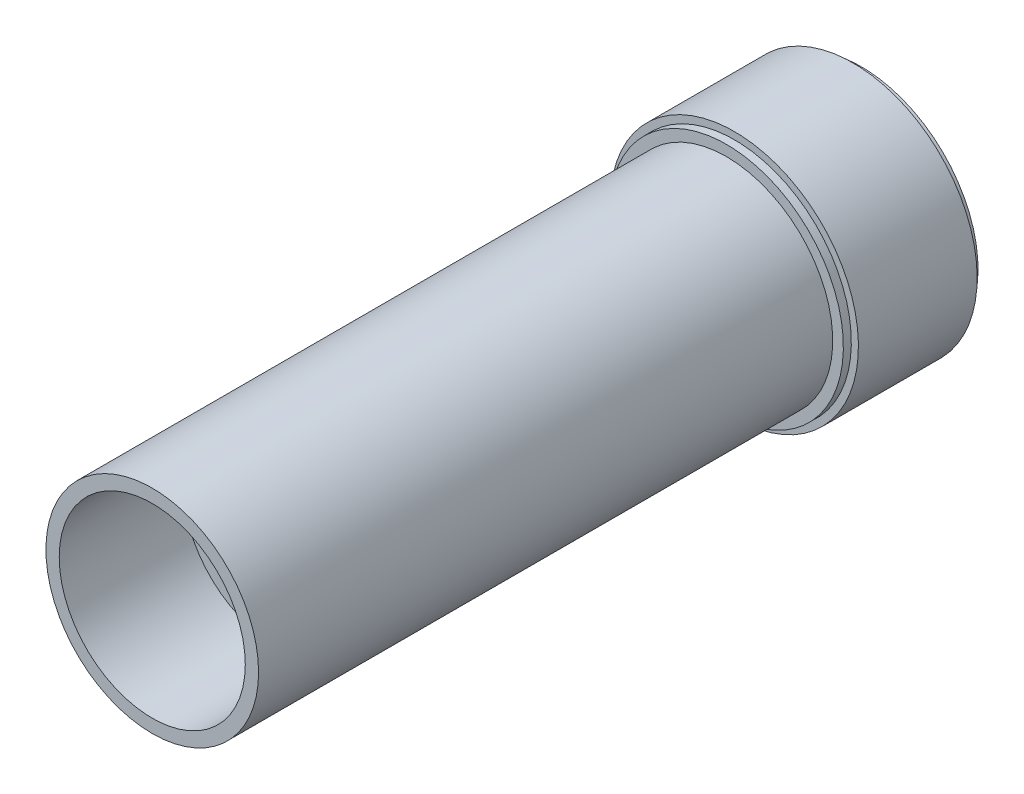
ISO-10303-21;
HEADER;
FILE_DESCRIPTION(('STEP AP214'),'2;1');
FILE_NAME('part.step','',(''),(''),'','','');
FILE_SCHEMA(('AUTOMOTIVE_DESIGN { 1 0 10303 214 1 1 1 1 }'));
ENDSEC;
DATA;
#1=APPLICATION_CONTEXT('core data for automotive mechanical design processes');
#2=APPLICATION_PROTOCOL_DEFINITION('international standard','automotive_design',2000,#1);
#3=PRODUCT_CONTEXT('',#1,'mechanical');
#4=PRODUCT('Part','Part','',(#3));
#5=PRODUCT_RELATED_PRODUCT_CATEGORY('part','',(#4));
#6=PRODUCT_DEFINITION_FORMATION('','',#4);
#7=PRODUCT_DEFINITION_CONTEXT('part definition',#1,'design');
#8=PRODUCT_DEFINITION('design','',#6,#7);
#9=PRODUCT_DEFINITION_SHAPE('','',#8);
#10=(LENGTH_UNIT() NAMED_UNIT(*) SI_UNIT(.MILLI.,.METRE.));
#11=(NAMED_UNIT(*) PLANE_ANGLE_UNIT() SI_UNIT($,.RADIAN.));
#12=(NAMED_UNIT(*) SI_UNIT($,.STERADIAN.) SOLID_ANGLE_UNIT());
#13=UNCERTAINTY_MEASURE_WITH_UNIT(LENGTH_MEASURE(1.E-05),#10,'distance_accuracy_value','');
#14=(GEOMETRIC_REPRESENTATION_CONTEXT(3) GLOBAL_UNCERTAINTY_ASSIGNED_CONTEXT((#13)) GLOBAL_UNIT_ASSIGNED_CONTEXT((#10,
#11,#12)) REPRESENTATION_CONTEXT('',''));
#15=CARTESIAN_POINT('',(0.,0.,0.));
#16=DIRECTION('',(0.,0.,1.));
#17=DIRECTION('',(1.,0.,0.));
#18=AXIS2_PLACEMENT_3D('',#15,#16,#17);
#19=CARTESIAN_POINT('',(0.,0.,13.4));
#20=DIRECTION('',(0.,0.,-1.));
#21=DIRECTION('',(0.,-1.,0.));
#22=AXIS2_PLACEMENT_3D('',#19,#20,#21);
#23=CYLINDRICAL_SURFACE('',#22,10.5);
#24=CARTESIAN_POINT('',(0.,0.,-15.2));
#25=DIRECTION('',(0.,0.,-1.));
#26=DIRECTION('',(0.,-1.,0.));
#27=AXIS2_PLACEMENT_3D('',#24,#25,#26);
#28=CIRCLE('',#27,10.5);
#29=CARTESIAN_POINT('',(0.,-10.5,-15.2));
#30=VERTEX_POINT('',#29);
#31=EDGE_CURVE('E10',#30,#30,#28,.T.);
#32=ORIENTED_EDGE('',*,*,#31,.T.);
#33=EDGE_LOOP('',(#32));
#34=FACE_BOUND('',#33,.T.);
#35=CARTESIAN_POINT('',(0.,0.,13.4));
#36=DIRECTION('',(0.,0.,-1.));
#37=DIRECTION('',(0.,-1.,0.));
#38=AXIS2_PLACEMENT_3D('',#35,#36,#37);
#39=CIRCLE('',#38,10.5);
#40=CARTESIAN_POINT('',(0.,-10.5,13.4));
#41=VERTEX_POINT('',#40);
#42=EDGE_CURVE('E30',#41,#41,#39,.T.);
#43=ORIENTED_EDGE('',*,*,#42,.F.);
#44=EDGE_LOOP('',(#43));
#45=FACE_BOUND('',#44,.T.);
#46=ADVANCED_FACE('F14',(#34,#45),#23,.F.);
#47=CARTESIAN_POINT('',(0.,0.,50.8));
#48=DIRECTION('',(0.,0.,1.));
#49=DIRECTION('',(1.,0.,0.));
#50=AXIS2_PLACEMENT_3D('',#47,#48,#49);
#51=CYLINDRICAL_SURFACE('',#50,10.5);
#52=CARTESIAN_POINT('',(0.,0.,64.8));
#53=DIRECTION('',(0.,0.,1.));
#54=DIRECTION('',(1.,0.,0.));
#55=AXIS2_PLACEMENT_3D('',#52,#53,#54);
#56=CIRCLE('',#55,10.5);
#57=CARTESIAN_POINT('',(10.5,0.,64.8));
#58=VERTEX_POINT('',#57);
#59=EDGE_CURVE('E22',#58,#58,#56,.T.);
#60=ORIENTED_EDGE('',*,*,#59,.T.);
#61=EDGE_LOOP('',(#60));
#62=FACE_BOUND('',#61,.T.);
#63=CARTESIAN_POINT('',(0.,0.,50.8));
#64=DIRECTION('',(0.,0.,1.));
#65=DIRECTION('',(1.,0.,0.));
#66=AXIS2_PLACEMENT_3D('',#63,#64,#65);
#67=CIRCLE('',#66,10.5);
#68=CARTESIAN_POINT('',(10.5,0.,50.8));
#69=VERTEX_POINT('',#68);
#70=EDGE_CURVE('E34',#69,#69,#67,.T.);
#71=ORIENTED_EDGE('',*,*,#70,.F.);
#72=EDGE_LOOP('',(#71));
#73=FACE_BOUND('',#72,.T.);
#74=ADVANCED_FACE('F84',(#62,#73),#51,.F.);
#75=CARTESIAN_POINT('',(0.,0.,-15.2));
#76=DIRECTION('',(0.,0.,1.));
#77=DIRECTION('',(1.,0.,0.));
#78=AXIS2_PLACEMENT_3D('',#75,#76,#77);
#79=CYLINDRICAL_SURFACE('',#78,13.2);
#80=CARTESIAN_POINT('',(0.,0.,-15.2));
#81=DIRECTION('',(0.,0.,-1.));
#82=DIRECTION('',(0.,-1.,0.));
#83=AXIS2_PLACEMENT_3D('',#80,#81,#82);
#84=CIRCLE('',#83,13.2);
#85=CARTESIAN_POINT('',(0.,-13.2,-15.2));
#86=VERTEX_POINT('',#85);
#87=EDGE_CURVE('E37',#86,#86,#84,.T.);
#88=ORIENTED_EDGE('',*,*,#87,.F.);
#89=EDGE_LOOP('',(#88));
#90=FACE_BOUND('',#89,.T.);
#91=CARTESIAN_POINT('',(0.,0.,-14.3));
#92=DIRECTION('',(0.,0.,-1.));
#93=DIRECTION('',(0.,-1.,0.));
#94=AXIS2_PLACEMENT_3D('',#91,#92,#93);
#95=CIRCLE('',#94,13.2);
#96=CARTESIAN_POINT('',(0.,-13.2,-14.3));
#97=VERTEX_POINT('',#96);
#98=EDGE_CURVE('E27',#97,#97,#95,.T.);
#99=ORIENTED_EDGE('',*,*,#98,.T.);
#100=EDGE_LOOP('',(#99));
#101=FACE_BOUND('',#100,.T.);
#102=ADVANCED_FACE('F89',(#90,#101),#79,.T.);
#103=CARTESIAN_POINT('',(0.,0.,-14.3));
#104=DIRECTION('',(0.,0.,1.));
#105=DIRECTION('',(1.,0.,0.));
#106=AXIS2_PLACEMENT_3D('',#103,#104,#105);
#107=CYLINDRICAL_SURFACE('',#106,14.);
#108=CARTESIAN_POINT('',(0.,0.,-14.3));
#109=DIRECTION('',(0.,0.,-1.));
#110=DIRECTION('',(0.,-1.,0.));
#111=AXIS2_PLACEMENT_3D('',#108,#109,#110);
#112=CIRCLE('',#111,14.);
#113=CARTESIAN_POINT('',(0.,-14.,-14.3));
#114=VERTEX_POINT('',#113);
#115=EDGE_CURVE('E44',#114,#114,#112,.T.);
#116=ORIENTED_EDGE('',*,*,#115,.F.);
#117=EDGE_LOOP('',(#116));
#118=FACE_BOUND('',#117,.T.);
#119=CARTESIAN_POINT('',(0.,0.,-0.9));
#120=DIRECTION('',(0.,0.,-1.));
#121=DIRECTION('',(0.,-1.,0.));
#122=AXIS2_PLACEMENT_3D('',#119,#120,#121);
#123=CIRCLE('',#122,14.);
#124=CARTESIAN_POINT('',(0.,-14.,-0.9));
#125=VERTEX_POINT('',#124);
#126=EDGE_CURVE('E43',#125,#125,#123,.T.);
#127=ORIENTED_EDGE('',*,*,#126,.T.);
#128=EDGE_LOOP('',(#127));
#129=FACE_BOUND('',#128,.T.);
#130=ADVANCED_FACE('F99',(#118,#129),#107,.T.);
#131=CARTESIAN_POINT('',(0.,0.,-0.9));
#132=DIRECTION('',(0.,0.,1.));
#133=DIRECTION('',(1.,0.,0.));
#134=AXIS2_PLACEMENT_3D('',#131,#132,#133);
#135=CYLINDRICAL_SURFACE('',#134,13.2);
#136=CARTESIAN_POINT('',(0.,0.,-0.9));
#137=DIRECTION('',(0.,0.,-1.));
#138=DIRECTION('',(0.,-1.,0.));
#139=AXIS2_PLACEMENT_3D('',#136,#137,#138);
#140=CIRCLE('',#139,13.2);
#141=CARTESIAN_POINT('',(0.,-13.2,-0.9));
#142=VERTEX_POINT('',#141);
#143=EDGE_CURVE('E40',#142,#142,#140,.T.);
#144=ORIENTED_EDGE('',*,*,#143,.F.);
#145=EDGE_LOOP('',(#144));
#146=FACE_BOUND('',#145,.T.);
#147=CARTESIAN_POINT('',(0.,0.,0.));
#148=DIRECTION('',(0.,0.,-1.));
#149=DIRECTION('',(0.,-1.,0.));
#150=AXIS2_PLACEMENT_3D('',#147,#148,#149);
#151=CIRCLE('',#150,13.2);
#152=CARTESIAN_POINT('',(0.,-13.2,0.));
#153=VERTEX_POINT('',#152);
#154=EDGE_CURVE('E50',#153,#153,#151,.T.);
#155=ORIENTED_EDGE('',*,*,#154,.T.);
#156=EDGE_LOOP('',(#155));
#157=FACE_BOUND('',#156,.T.);
#158=ADVANCED_FACE('F95',(#146,#157),#135,.T.);
#159=CARTESIAN_POINT('',(0.,0.,64.8));
#160=DIRECTION('',(0.,0.,-1.));
#161=DIRECTION('',(0.,-1.,0.));
#162=AXIS2_PLACEMENT_3D('',#159,#160,#161);
#163=CYLINDRICAL_SURFACE('',#162,12.);
#164=CARTESIAN_POINT('',(0.,0.,64.8));
#165=DIRECTION('',(0.,0.,1.));
#166=DIRECTION('',(1.,0.,0.));
#167=AXIS2_PLACEMENT_3D('',#164,#165,#166);
#168=CIRCLE('',#167,12.);
#169=CARTESIAN_POINT('',(12.,0.,64.8));
#170=VERTEX_POINT('',#169);
#171=EDGE_CURVE('E55',#170,#170,#168,.T.);
#172=ORIENTED_EDGE('',*,*,#171,.F.);
#173=EDGE_LOOP('',(#172));
#174=FACE_BOUND('',#173,.T.);
#175=CARTESIAN_POINT('',(0.,0.,0.));
#176=DIRECTION('',(0.,0.,-1.));
#177=DIRECTION('',(0.,-1.,0.));
#178=AXIS2_PLACEMENT_3D('',#175,#176,#177);
#179=CIRCLE('',#178,12.);
#180=CARTESIAN_POINT('',(0.,-12.,0.));
#181=VERTEX_POINT('',#180);
#182=EDGE_CURVE('E47',#181,#181,#179,.T.);
#183=ORIENTED_EDGE('',*,*,#182,.F.);
#184=EDGE_LOOP('',(#183));
#185=FACE_BOUND('',#184,.T.);
#186=ADVANCED_FACE('F67',(#174,#185),#163,.T.);
#187=CARTESIAN_POINT('',(0.,0.,-15.2));
#188=DIRECTION('',(0.,0.,1.));
#189=DIRECTION('',(1.,0.,0.));
#190=AXIS2_PLACEMENT_3D('',#187,#188,#189);
#191=CYLINDRICAL_SURFACE('',#190,8.5);
#192=CARTESIAN_POINT('',(0.,0.,50.8));
#193=DIRECTION('',(0.,0.,-1.));
#194=DIRECTION('',(0.,-1.,0.));
#195=AXIS2_PLACEMENT_3D('',#192,#193,#194);
#196=CIRCLE('',#195,8.5);
#197=CARTESIAN_POINT('',(0.,-8.5,50.8));
#198=VERTEX_POINT('',#197);
#199=EDGE_CURVE('E32',#198,#198,#196,.T.);
#200=ORIENTED_EDGE('',*,*,#199,.F.);
#201=EDGE_LOOP('',(#200));
#202=FACE_BOUND('',#201,.T.);
#203=CARTESIAN_POINT('',(0.,0.,13.4));
#204=DIRECTION('',(0.,0.,1.));
#205=DIRECTION('',(1.,0.,0.));
#206=AXIS2_PLACEMENT_3D('',#203,#204,#205);
#207=CIRCLE('',#206,8.5);
#208=CARTESIAN_POINT('',(8.5,0.,13.4));
#209=VERTEX_POINT('',#208);
#210=EDGE_CURVE('E18',#209,#209,#207,.T.);
#211=ORIENTED_EDGE('',*,*,#210,.F.);
#212=EDGE_LOOP('',(#211));
#213=FACE_BOUND('',#212,.T.);
#214=ADVANCED_FACE('F16',(#202,#213),#191,.F.);
#215=CARTESIAN_POINT('',(0.,0.,64.8));
#216=DIRECTION('',(0.,0.,1.));
#217=DIRECTION('',(1.,0.,0.));
#218=AXIS2_PLACEMENT_3D('',#215,#216,#217);
#219=PLANE('',#218);
#220=ORIENTED_EDGE('',*,*,#171,.T.);
#221=EDGE_LOOP('',(#220));
#222=FACE_BOUND('',#221,.T.);
#223=ORIENTED_EDGE('',*,*,#59,.F.);
#224=EDGE_LOOP('',(#223));
#225=FACE_BOUND('',#224,.T.);
#226=ADVANCED_FACE('F66',(#222,#225),#219,.T.);
#227=CARTESIAN_POINT('',(0.,0.,0.));
#228=DIRECTION('',(0.,0.,-1.));
#229=DIRECTION('',(-1.,0.,0.));
#230=AXIS2_PLACEMENT_3D('',#227,#228,#229);
#231=PLANE('',#230);
#232=ORIENTED_EDGE('',*,*,#154,.F.);
#233=EDGE_LOOP('',(#232));
#234=FACE_BOUND('',#233,.T.);
#235=ORIENTED_EDGE('',*,*,#182,.T.);
#236=EDGE_LOOP('',(#235));
#237=FACE_BOUND('',#236,.T.);
#238=ADVANCED_FACE('F114',(#234,#237),#231,.F.);
#239=CARTESIAN_POINT('',(0.,0.,-14.3));
#240=DIRECTION('',(0.,0.,-1.));
#241=DIRECTION('',(-1.,0.,0.));
#242=AXIS2_PLACEMENT_3D('',#239,#240,#241);
#243=PLANE('',#242);
#244=ORIENTED_EDGE('',*,*,#115,.T.);
#245=EDGE_LOOP('',(#244));
#246=FACE_BOUND('',#245,.T.);
#247=ORIENTED_EDGE('',*,*,#98,.F.);
#248=EDGE_LOOP('',(#247));
#249=FACE_BOUND('',#248,.T.);
#250=ADVANCED_FACE('F111',(#246,#249),#243,.T.);
#251=CARTESIAN_POINT('',(0.,0.,-0.9));
#252=DIRECTION('',(0.,0.,-1.));
#253=DIRECTION('',(-1.,0.,0.));
#254=AXIS2_PLACEMENT_3D('',#251,#252,#253);
#255=PLANE('',#254);
#256=ORIENTED_EDGE('',*,*,#126,.F.);
#257=EDGE_LOOP('',(#256));
#258=FACE_BOUND('',#257,.T.);
#259=ORIENTED_EDGE('',*,*,#143,.T.);
#260=EDGE_LOOP('',(#259));
#261=FACE_BOUND('',#260,.T.);
#262=ADVANCED_FACE('F113',(#258,#261),#255,.F.);
#263=CARTESIAN_POINT('',(0.,0.,-15.2));
#264=DIRECTION('',(0.,0.,-1.));
#265=DIRECTION('',(-1.,0.,0.));
#266=AXIS2_PLACEMENT_3D('',#263,#264,#265);
#267=PLANE('',#266);
#268=ORIENTED_EDGE('',*,*,#87,.T.);
#269=EDGE_LOOP('',(#268));
#270=FACE_BOUND('',#269,.T.);
#271=ORIENTED_EDGE('',*,*,#31,.F.);
#272=EDGE_LOOP('',(#271));
#273=FACE_BOUND('',#272,.T.);
#274=ADVANCED_FACE('F79',(#270,#273),#267,.T.);
#275=CARTESIAN_POINT('',(0.,0.,50.8));
#276=DIRECTION('',(0.,0.,1.));
#277=DIRECTION('',(1.,0.,0.));
#278=AXIS2_PLACEMENT_3D('',#275,#276,#277);
#279=PLANE('',#278);
#280=ORIENTED_EDGE('',*,*,#70,.T.);
#281=EDGE_LOOP('',(#280));
#282=FACE_BOUND('',#281,.T.);
#283=ORIENTED_EDGE('',*,*,#199,.T.);
#284=EDGE_LOOP('',(#283));
#285=FACE_BOUND('',#284,.T.);
#286=ADVANCED_FACE('F62',(#282,#285),#279,.T.);
#287=CARTESIAN_POINT('',(0.,0.,13.4));
#288=DIRECTION('',(0.,0.,-1.));
#289=DIRECTION('',(-1.,0.,0.));
#290=AXIS2_PLACEMENT_3D('',#287,#288,#289);
#291=PLANE('',#290);
#292=ORIENTED_EDGE('',*,*,#42,.T.);
#293=EDGE_LOOP('',(#292));
#294=FACE_BOUND('',#293,.T.);
#295=ORIENTED_EDGE('',*,*,#210,.T.);
#296=EDGE_LOOP('',(#295));
#297=FACE_BOUND('',#296,.T.);
#298=ADVANCED_FACE('F71',(#294,#297),#291,.T.);
#299=CLOSED_SHELL('',(#46,#74,#102,#130,#158,#186,#214,#226,#238,#250,#262,#274,#286,#298));
#300=MANIFOLD_SOLID_BREP('B1',#299);
#301=ADVANCED_BREP_SHAPE_REPRESENTATION('',(#18,#300),#14);
#302=SHAPE_DEFINITION_REPRESENTATION(#9,#301);
ENDSEC;
END-ISO-10303-21;
